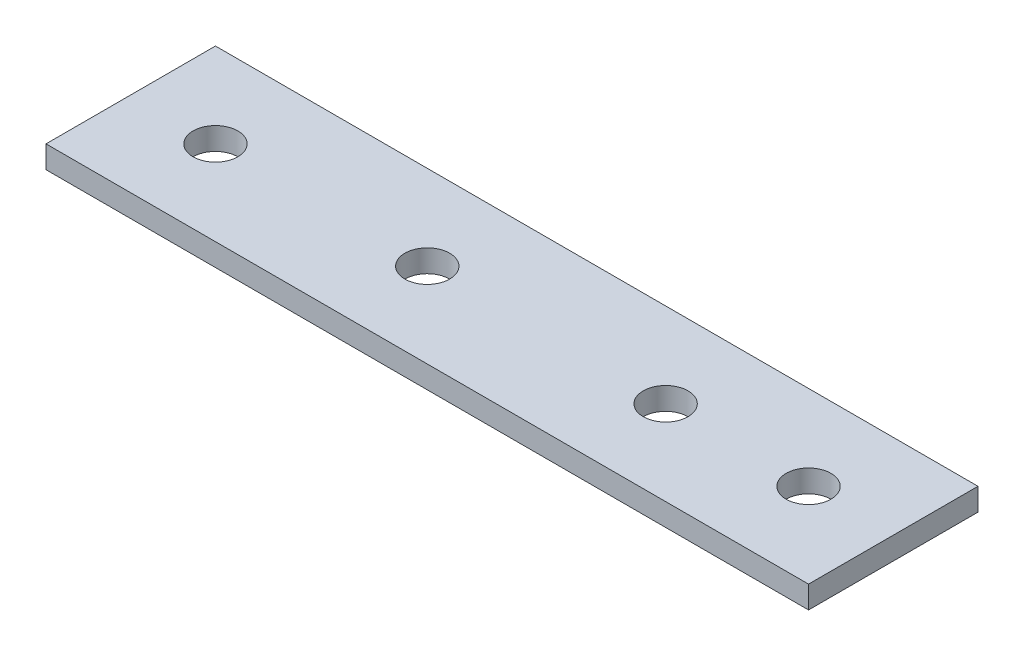
ISO-10303-21;
HEADER;
FILE_DESCRIPTION(('STEP AP214'),'2;1');
FILE_NAME('part.step','',(''),(''),'','','');
FILE_SCHEMA(('AUTOMOTIVE_DESIGN { 1 0 10303 214 1 1 1 1 }'));
ENDSEC;
DATA;
#1=APPLICATION_CONTEXT('core data for automotive mechanical design processes');
#2=APPLICATION_PROTOCOL_DEFINITION('international standard','automotive_design',2000,#1);
#3=PRODUCT_CONTEXT('',#1,'mechanical');
#4=PRODUCT('Part','Part','',(#3));
#5=PRODUCT_RELATED_PRODUCT_CATEGORY('part','',(#4));
#6=PRODUCT_DEFINITION_FORMATION('','',#4);
#7=PRODUCT_DEFINITION_CONTEXT('part definition',#1,'design');
#8=PRODUCT_DEFINITION('design','',#6,#7);
#9=PRODUCT_DEFINITION_SHAPE('','',#8);
#10=(LENGTH_UNIT() NAMED_UNIT(*) SI_UNIT(.MILLI.,.METRE.));
#11=(NAMED_UNIT(*) PLANE_ANGLE_UNIT() SI_UNIT($,.RADIAN.));
#12=(NAMED_UNIT(*) SI_UNIT($,.STERADIAN.) SOLID_ANGLE_UNIT());
#13=UNCERTAINTY_MEASURE_WITH_UNIT(LENGTH_MEASURE(1.E-05),#10,'distance_accuracy_value','');
#14=(GEOMETRIC_REPRESENTATION_CONTEXT(3) GLOBAL_UNCERTAINTY_ASSIGNED_CONTEXT((#13)) GLOBAL_UNIT_ASSIGNED_CONTEXT((#10,
#11,#12)) REPRESENTATION_CONTEXT('',''));
#15=CARTESIAN_POINT('',(0.,0.,0.));
#16=DIRECTION('',(0.,0.,1.));
#17=DIRECTION('',(1.,0.,0.));
#18=AXIS2_PLACEMENT_3D('',#15,#16,#17);
#19=CARTESIAN_POINT('',(0.,0.79375,0.));
#20=DIRECTION('',(0.,1.,0.));
#21=DIRECTION('',(0.,0.,1.));
#22=AXIS2_PLACEMENT_3D('',#19,#20,#21);
#23=PLANE('',#22);
#24=CARTESIAN_POINT('',(-6.,0.79375,0.));
#25=DIRECTION('',(0.,1.,0.));
#26=DIRECTION('',(0.,0.,1.));
#27=AXIS2_PLACEMENT_3D('',#24,#25,#26);
#28=CIRCLE('',#27,1.5875);
#29=CARTESIAN_POINT('',(-6.,0.79375,1.5875));
#30=VERTEX_POINT('',#29);
#31=EDGE_CURVE('E121',#30,#30,#28,.T.);
#32=ORIENTED_EDGE('',*,*,#31,.F.);
#33=EDGE_LOOP('',(#32));
#34=FACE_BOUND('',#33,.T.);
#35=CARTESIAN_POINT('',(-21.,0.79375,0.));
#36=DIRECTION('',(0.,1.,0.));
#37=DIRECTION('',(0.,0.,1.));
#38=AXIS2_PLACEMENT_3D('',#35,#36,#37);
#39=CIRCLE('',#38,1.5875);
#40=CARTESIAN_POINT('',(-21.,0.79375,1.5875));
#41=VERTEX_POINT('',#40);
#42=EDGE_CURVE('E100',#41,#41,#39,.T.);
#43=ORIENTED_EDGE('',*,*,#42,.F.);
#44=EDGE_LOOP('',(#43));
#45=FACE_BOUND('',#44,.T.);
#46=DIRECTION('',(0.,0.,1.));
#47=VECTOR('',#46,1.);
#48=CARTESIAN_POINT('',(-27.,0.79375,6.));
#49=LINE('',#48,#47);
#50=CARTESIAN_POINT('',(-27.,0.79375,-6.));
#51=VERTEX_POINT('',#50);
#52=CARTESIAN_POINT('',(-27.,0.79375,6.));
#53=VERTEX_POINT('',#52);
#54=EDGE_CURVE('E85',#51,#53,#49,.T.);
#55=ORIENTED_EDGE('',*,*,#54,.T.);
#56=DIRECTION('',(1.,0.,0.));
#57=VECTOR('',#56,1.);
#58=CARTESIAN_POINT('',(27.,0.79375,6.));
#59=LINE('',#58,#57);
#60=CARTESIAN_POINT('',(27.,0.79375,6.));
#61=VERTEX_POINT('',#60);
#62=EDGE_CURVE('E80',#53,#61,#59,.T.);
#63=ORIENTED_EDGE('',*,*,#62,.T.);
#64=DIRECTION('',(0.,0.,-1.));
#65=VECTOR('',#64,1.);
#66=CARTESIAN_POINT('',(27.,0.79375,6.));
#67=LINE('',#66,#65);
#68=CARTESIAN_POINT('',(27.,0.79375,-6.));
#69=VERTEX_POINT('',#68);
#70=EDGE_CURVE('E83',#61,#69,#67,.T.);
#71=ORIENTED_EDGE('',*,*,#70,.T.);
#72=DIRECTION('',(-1.,0.,0.));
#73=VECTOR('',#72,1.);
#74=CARTESIAN_POINT('',(27.,0.79375,-6.));
#75=LINE('',#74,#73);
#76=EDGE_CURVE('E50',#69,#51,#75,.T.);
#77=ORIENTED_EDGE('',*,*,#76,.T.);
#78=EDGE_LOOP('',(#55,#63,#71,#77));
#79=FACE_BOUND('',#78,.T.);
#80=CARTESIAN_POINT('',(21.,0.79375,0.));
#81=DIRECTION('',(0.,1.,0.));
#82=DIRECTION('',(0.,0.,1.));
#83=AXIS2_PLACEMENT_3D('',#80,#81,#82);
#84=CIRCLE('',#83,1.5875);
#85=CARTESIAN_POINT('',(21.,0.79375,1.5875));
#86=VERTEX_POINT('',#85);
#87=EDGE_CURVE('E115',#86,#86,#84,.T.);
#88=ORIENTED_EDGE('',*,*,#87,.F.);
#89=EDGE_LOOP('',(#88));
#90=FACE_BOUND('',#89,.T.);
#91=CARTESIAN_POINT('',(10.88,0.79375,0.));
#92=DIRECTION('',(0.,1.,0.));
#93=DIRECTION('',(0.,0.,1.));
#94=AXIS2_PLACEMENT_3D('',#91,#92,#93);
#95=CIRCLE('',#94,1.5875);
#96=CARTESIAN_POINT('',(10.88,0.79375,1.5875));
#97=VERTEX_POINT('',#96);
#98=EDGE_CURVE('E127',#97,#97,#95,.T.);
#99=ORIENTED_EDGE('',*,*,#98,.F.);
#100=EDGE_LOOP('',(#99));
#101=FACE_BOUND('',#100,.T.);
#102=ADVANCED_FACE('F33',(#34,#45,#79,#90,#101),#23,.T.);
#103=CARTESIAN_POINT('',(0.,-0.79375,0.));
#104=DIRECTION('',(0.,1.,0.));
#105=DIRECTION('',(0.,0.,1.));
#106=AXIS2_PLACEMENT_3D('',#103,#104,#105);
#107=PLANE('',#106);
#108=CARTESIAN_POINT('',(-6.,-0.79375,0.));
#109=DIRECTION('',(0.,1.,0.));
#110=DIRECTION('',(0.,0.,1.));
#111=AXIS2_PLACEMENT_3D('',#108,#109,#110);
#112=CIRCLE('',#111,1.5875);
#113=CARTESIAN_POINT('',(-6.,-0.79375,1.5875));
#114=VERTEX_POINT('',#113);
#115=EDGE_CURVE('E124',#114,#114,#112,.T.);
#116=ORIENTED_EDGE('',*,*,#115,.T.);
#117=EDGE_LOOP('',(#116));
#118=FACE_BOUND('',#117,.T.);
#119=CARTESIAN_POINT('',(-21.,-0.79375,0.));
#120=DIRECTION('',(0.,1.,0.));
#121=DIRECTION('',(0.,0.,1.));
#122=AXIS2_PLACEMENT_3D('',#119,#120,#121);
#123=CIRCLE('',#122,1.5875);
#124=CARTESIAN_POINT('',(-21.,-0.79375,1.5875));
#125=VERTEX_POINT('',#124);
#126=EDGE_CURVE('E112',#125,#125,#123,.T.);
#127=ORIENTED_EDGE('',*,*,#126,.T.);
#128=EDGE_LOOP('',(#127));
#129=FACE_BOUND('',#128,.T.);
#130=DIRECTION('',(0.,0.,1.));
#131=VECTOR('',#130,1.);
#132=CARTESIAN_POINT('',(-27.,-0.79375,6.));
#133=LINE('',#132,#131);
#134=CARTESIAN_POINT('',(-27.,-0.79375,-6.));
#135=VERTEX_POINT('',#134);
#136=CARTESIAN_POINT('',(-27.,-0.79375,6.));
#137=VERTEX_POINT('',#136);
#138=EDGE_CURVE('E97',#135,#137,#133,.T.);
#139=ORIENTED_EDGE('',*,*,#138,.F.);
#140=DIRECTION('',(-1.,0.,0.));
#141=VECTOR('',#140,1.);
#142=CARTESIAN_POINT('',(27.,-0.79375,-6.));
#143=LINE('',#142,#141);
#144=CARTESIAN_POINT('',(27.,-0.79375,-6.));
#145=VERTEX_POINT('',#144);
#146=EDGE_CURVE('E73',#145,#135,#143,.T.);
#147=ORIENTED_EDGE('',*,*,#146,.F.);
#148=DIRECTION('',(0.,0.,-1.));
#149=VECTOR('',#148,1.);
#150=CARTESIAN_POINT('',(27.,-0.79375,6.));
#151=LINE('',#150,#149);
#152=CARTESIAN_POINT('',(27.,-0.79375,6.));
#153=VERTEX_POINT('',#152);
#154=EDGE_CURVE('E67',#153,#145,#151,.T.);
#155=ORIENTED_EDGE('',*,*,#154,.F.);
#156=DIRECTION('',(1.,0.,0.));
#157=VECTOR('',#156,1.);
#158=CARTESIAN_POINT('',(27.,-0.79375,6.));
#159=LINE('',#158,#157);
#160=EDGE_CURVE('E89',#137,#153,#159,.T.);
#161=ORIENTED_EDGE('',*,*,#160,.F.);
#162=EDGE_LOOP('',(#139,#147,#155,#161));
#163=FACE_BOUND('',#162,.T.);
#164=CARTESIAN_POINT('',(21.,-0.79375,0.));
#165=DIRECTION('',(0.,1.,0.));
#166=DIRECTION('',(0.,0.,1.));
#167=AXIS2_PLACEMENT_3D('',#164,#165,#166);
#168=CIRCLE('',#167,1.5875);
#169=CARTESIAN_POINT('',(21.,-0.79375,1.5875));
#170=VERTEX_POINT('',#169);
#171=EDGE_CURVE('E118',#170,#170,#168,.T.);
#172=ORIENTED_EDGE('',*,*,#171,.T.);
#173=EDGE_LOOP('',(#172));
#174=FACE_BOUND('',#173,.T.);
#175=CARTESIAN_POINT('',(10.88,-0.79375,0.));
#176=DIRECTION('',(0.,1.,0.));
#177=DIRECTION('',(0.,0.,1.));
#178=AXIS2_PLACEMENT_3D('',#175,#176,#177);
#179=CIRCLE('',#178,1.5875);
#180=CARTESIAN_POINT('',(10.88,-0.79375,1.5875));
#181=VERTEX_POINT('',#180);
#182=EDGE_CURVE('E130',#181,#181,#179,.T.);
#183=ORIENTED_EDGE('',*,*,#182,.T.);
#184=EDGE_LOOP('',(#183));
#185=FACE_BOUND('',#184,.T.);
#186=ADVANCED_FACE('F108',(#118,#129,#163,#174,#185),#107,.F.);
#187=CARTESIAN_POINT('',(-27.,0.79375,6.));
#188=DIRECTION('',(1.,0.,0.));
#189=DIRECTION('',(0.,0.,-1.));
#190=AXIS2_PLACEMENT_3D('',#187,#188,#189);
#191=PLANE('',#190);
#192=ORIENTED_EDGE('',*,*,#138,.T.);
#193=DIRECTION('',(0.,-1.,0.));
#194=VECTOR('',#193,1.);
#195=CARTESIAN_POINT('',(-27.,0.79375,6.));
#196=LINE('',#195,#194);
#197=EDGE_CURVE('E11',#53,#137,#196,.T.);
#198=ORIENTED_EDGE('',*,*,#197,.F.);
#199=ORIENTED_EDGE('',*,*,#54,.F.);
#200=DIRECTION('',(0.,-1.,0.));
#201=VECTOR('',#200,1.);
#202=CARTESIAN_POINT('',(-27.,0.79375,-6.));
#203=LINE('',#202,#201);
#204=EDGE_CURVE('E93',#51,#135,#203,.T.);
#205=ORIENTED_EDGE('',*,*,#204,.T.);
#206=EDGE_LOOP('',(#192,#198,#199,#205));
#207=FACE_BOUND('',#206,.T.);
#208=ADVANCED_FACE('F35',(#207),#191,.F.);
#209=CARTESIAN_POINT('',(27.,0.79375,6.));
#210=DIRECTION('',(0.,0.,-1.));
#211=DIRECTION('',(-1.,0.,0.));
#212=AXIS2_PLACEMENT_3D('',#209,#210,#211);
#213=PLANE('',#212);
#214=ORIENTED_EDGE('',*,*,#160,.T.);
#215=DIRECTION('',(0.,-1.,0.));
#216=VECTOR('',#215,1.);
#217=CARTESIAN_POINT('',(27.,0.79375,6.));
#218=LINE('',#217,#216);
#219=EDGE_CURVE('E42',#61,#153,#218,.T.);
#220=ORIENTED_EDGE('',*,*,#219,.F.);
#221=ORIENTED_EDGE('',*,*,#62,.F.);
#222=ORIENTED_EDGE('',*,*,#197,.T.);
#223=EDGE_LOOP('',(#214,#220,#221,#222));
#224=FACE_BOUND('',#223,.T.);
#225=ADVANCED_FACE('F88',(#224),#213,.F.);
#226=CARTESIAN_POINT('',(27.,0.79375,6.));
#227=DIRECTION('',(-1.,0.,0.));
#228=DIRECTION('',(0.,0.,1.));
#229=AXIS2_PLACEMENT_3D('',#226,#227,#228);
#230=PLANE('',#229);
#231=ORIENTED_EDGE('',*,*,#154,.T.);
#232=DIRECTION('',(0.,-1.,0.));
#233=VECTOR('',#232,1.);
#234=CARTESIAN_POINT('',(27.,0.79375,-6.));
#235=LINE('',#234,#233);
#236=EDGE_CURVE('E90',#69,#145,#235,.T.);
#237=ORIENTED_EDGE('',*,*,#236,.F.);
#238=ORIENTED_EDGE('',*,*,#70,.F.);
#239=ORIENTED_EDGE('',*,*,#219,.T.);
#240=EDGE_LOOP('',(#231,#237,#238,#239));
#241=FACE_BOUND('',#240,.T.);
#242=ADVANCED_FACE('F91',(#241),#230,.F.);
#243=CARTESIAN_POINT('',(27.,0.79375,-6.));
#244=DIRECTION('',(0.,0.,1.));
#245=DIRECTION('',(1.,0.,0.));
#246=AXIS2_PLACEMENT_3D('',#243,#244,#245);
#247=PLANE('',#246);
#248=ORIENTED_EDGE('',*,*,#146,.T.);
#249=ORIENTED_EDGE('',*,*,#204,.F.);
#250=ORIENTED_EDGE('',*,*,#76,.F.);
#251=ORIENTED_EDGE('',*,*,#236,.T.);
#252=EDGE_LOOP('',(#248,#249,#250,#251));
#253=FACE_BOUND('',#252,.T.);
#254=ADVANCED_FACE('F105',(#253),#247,.F.);
#255=CARTESIAN_POINT('',(-21.,0.79375,0.));
#256=DIRECTION('',(0.,-1.,0.));
#257=DIRECTION('',(0.,0.,-1.));
#258=AXIS2_PLACEMENT_3D('',#255,#256,#257);
#259=CYLINDRICAL_SURFACE('',#258,1.5875);
#260=ORIENTED_EDGE('',*,*,#42,.T.);
#261=EDGE_LOOP('',(#260));
#262=FACE_BOUND('',#261,.T.);
#263=ORIENTED_EDGE('',*,*,#126,.F.);
#264=EDGE_LOOP('',(#263));
#265=FACE_BOUND('',#264,.T.);
#266=ADVANCED_FACE('F150',(#262,#265),#259,.F.);
#267=CARTESIAN_POINT('',(21.,0.79375,0.));
#268=DIRECTION('',(0.,-1.,0.));
#269=DIRECTION('',(0.,0.,-1.));
#270=AXIS2_PLACEMENT_3D('',#267,#268,#269);
#271=CYLINDRICAL_SURFACE('',#270,1.5875);
#272=ORIENTED_EDGE('',*,*,#87,.T.);
#273=EDGE_LOOP('',(#272));
#274=FACE_BOUND('',#273,.T.);
#275=ORIENTED_EDGE('',*,*,#171,.F.);
#276=EDGE_LOOP('',(#275));
#277=FACE_BOUND('',#276,.T.);
#278=ADVANCED_FACE('F196',(#274,#277),#271,.F.);
#279=CARTESIAN_POINT('',(-6.,0.79375,0.));
#280=DIRECTION('',(0.,-1.,0.));
#281=DIRECTION('',(0.,0.,-1.));
#282=AXIS2_PLACEMENT_3D('',#279,#280,#281);
#283=CYLINDRICAL_SURFACE('',#282,1.5875);
#284=ORIENTED_EDGE('',*,*,#31,.T.);
#285=EDGE_LOOP('',(#284));
#286=FACE_BOUND('',#285,.T.);
#287=ORIENTED_EDGE('',*,*,#115,.F.);
#288=EDGE_LOOP('',(#287));
#289=FACE_BOUND('',#288,.T.);
#290=ADVANCED_FACE('F204',(#286,#289),#283,.F.);
#291=CARTESIAN_POINT('',(10.88,0.79375,0.));
#292=DIRECTION('',(0.,-1.,0.));
#293=DIRECTION('',(0.,0.,-1.));
#294=AXIS2_PLACEMENT_3D('',#291,#292,#293);
#295=CYLINDRICAL_SURFACE('',#294,1.5875);
#296=ORIENTED_EDGE('',*,*,#98,.T.);
#297=EDGE_LOOP('',(#296));
#298=FACE_BOUND('',#297,.T.);
#299=ORIENTED_EDGE('',*,*,#182,.F.);
#300=EDGE_LOOP('',(#299));
#301=FACE_BOUND('',#300,.T.);
#302=ADVANCED_FACE('F136',(#298,#301),#295,.F.);
#303=CLOSED_SHELL('',(#102,#186,#208,#225,#242,#254,#266,#278,#290,#302));
#304=MANIFOLD_SOLID_BREP('B2',#303);
#305=ADVANCED_BREP_SHAPE_REPRESENTATION('',(#18,#304),#14);
#306=SHAPE_DEFINITION_REPRESENTATION(#9,#305);
ENDSEC;
END-ISO-10303-21;
